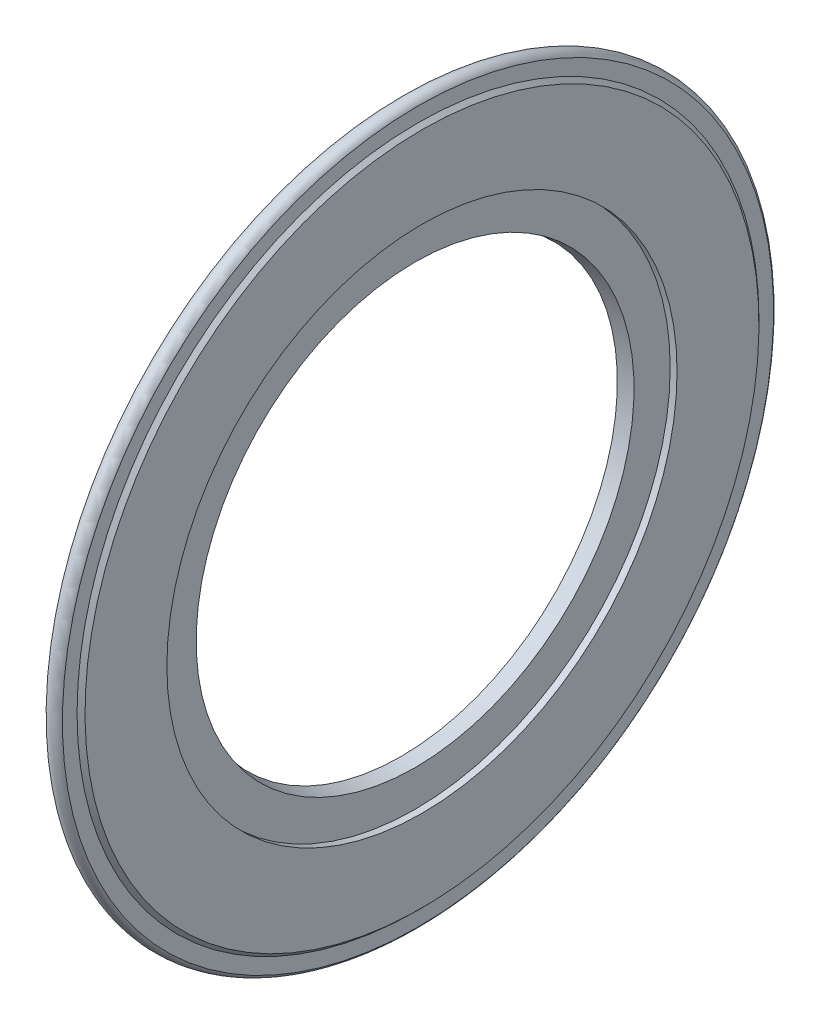
ISO-10303-21;
HEADER;
FILE_DESCRIPTION(('STEP AP214'),'2;1');
FILE_NAME('part.step','',(''),(''),'','','');
FILE_SCHEMA(('AUTOMOTIVE_DESIGN { 1 0 10303 214 1 1 1 1 }'));
ENDSEC;
DATA;
#1=APPLICATION_CONTEXT('core data for automotive mechanical design processes');
#2=APPLICATION_PROTOCOL_DEFINITION('international standard','automotive_design',2000,#1);
#3=PRODUCT_CONTEXT('',#1,'mechanical');
#4=PRODUCT('Part','Part','',(#3));
#5=PRODUCT_RELATED_PRODUCT_CATEGORY('part','',(#4));
#6=PRODUCT_DEFINITION_FORMATION('','',#4);
#7=PRODUCT_DEFINITION_CONTEXT('part definition',#1,'design');
#8=PRODUCT_DEFINITION('design','',#6,#7);
#9=PRODUCT_DEFINITION_SHAPE('','',#8);
#10=(LENGTH_UNIT() NAMED_UNIT(*) SI_UNIT(.MILLI.,.METRE.));
#11=(NAMED_UNIT(*) PLANE_ANGLE_UNIT() SI_UNIT($,.RADIAN.));
#12=(NAMED_UNIT(*) SI_UNIT($,.STERADIAN.) SOLID_ANGLE_UNIT());
#13=UNCERTAINTY_MEASURE_WITH_UNIT(LENGTH_MEASURE(1.E-05),#10,'distance_accuracy_value','');
#14=(GEOMETRIC_REPRESENTATION_CONTEXT(3) GLOBAL_UNCERTAINTY_ASSIGNED_CONTEXT((#13)) GLOBAL_UNIT_ASSIGNED_CONTEXT((#10,
#11,#12)) REPRESENTATION_CONTEXT('',''));
#15=CARTESIAN_POINT('',(0.,0.,0.));
#16=DIRECTION('',(0.,0.,1.));
#17=DIRECTION('',(1.,0.,0.));
#18=AXIS2_PLACEMENT_3D('',#15,#16,#17);
#19=CARTESIAN_POINT('',(11.2134,0.,0.));
#20=DIRECTION('',(1.,0.,0.));
#21=DIRECTION('',(0.,1.,0.));
#22=AXIS2_PLACEMENT_3D('',#19,#20,#21);
#23=CONICAL_SURFACE('',#22,10.8581303859662,0.174532925199433);
#24=CARTESIAN_POINT('',(10.86,0.,0.));
#25=DIRECTION('',(-1.,0.,0.));
#26=DIRECTION('',(0.,1.,0.));
#27=AXIS2_PLACEMENT_3D('',#24,#25,#26);
#28=CIRCLE('',#27,10.7958164309839);
#29=CARTESIAN_POINT('',(10.86,10.7958164309839,0.));
#30=VERTEX_POINT('',#29);
#31=EDGE_CURVE('E11',#30,#30,#28,.T.);
#32=ORIENTED_EDGE('',*,*,#31,.T.);
#33=EDGE_LOOP('',(#32));
#34=FACE_BOUND('',#33,.T.);
#35=CARTESIAN_POINT('',(11.5668,0.,0.));
#36=DIRECTION('',(-1.,0.,0.));
#37=DIRECTION('',(0.,1.,0.));
#38=AXIS2_PLACEMENT_3D('',#35,#36,#37);
#39=CIRCLE('',#38,10.9204443409486);
#40=CARTESIAN_POINT('',(11.5668,10.9204443409486,0.));
#41=VERTEX_POINT('',#40);
#42=EDGE_CURVE('E74',#41,#41,#39,.T.);
#43=ORIENTED_EDGE('',*,*,#42,.F.);
#44=EDGE_LOOP('',(#43));
#45=FACE_BOUND('',#44,.T.);
#46=ADVANCED_FACE('F16',(#34,#45),#23,.F.);
#47=CARTESIAN_POINT('',(10.6900266473844,0.,0.));
#48=DIRECTION('',(-1.,0.,0.));
#49=DIRECTION('',(0.,1.,0.));
#50=AXIS2_PLACEMENT_3D('',#47,#48,#49);
#51=CONICAL_SURFACE('',#50,11.7597832154919,1.39626340159546);
#52=CARTESIAN_POINT('',(10.5200532947689,0.,0.));
#53=DIRECTION('',(-1.,0.,0.));
#54=DIRECTION('',(0.,1.,0.));
#55=AXIS2_PLACEMENT_3D('',#52,#53,#54);
#56=CIRCLE('',#55,12.72375);
#57=CARTESIAN_POINT('',(10.5200532947689,12.72375,0.));
#58=VERTEX_POINT('',#57);
#59=EDGE_CURVE('E26',#58,#58,#56,.T.);
#60=ORIENTED_EDGE('',*,*,#59,.T.);
#61=EDGE_LOOP('',(#60));
#62=FACE_BOUND('',#61,.T.);
#63=ORIENTED_EDGE('',*,*,#31,.F.);
#64=EDGE_LOOP('',(#63));
#65=FACE_BOUND('',#64,.T.);
#66=ADVANCED_FACE('F99',(#62,#65),#51,.F.);
#67=CARTESIAN_POINT('',(10.3480266473844,0.,0.));
#68=DIRECTION('',(1.,0.,0.));
#69=DIRECTION('',(0.,1.,0.));
#70=AXIS2_PLACEMENT_3D('',#67,#68,#69);
#71=CYLINDRICAL_SURFACE('',#70,12.72375);
#72=CARTESIAN_POINT('',(10.176,0.,0.));
#73=DIRECTION('',(-1.,0.,0.));
#74=DIRECTION('',(0.,1.,0.));
#75=AXIS2_PLACEMENT_3D('',#72,#73,#74);
#76=CIRCLE('',#75,12.72375);
#77=CARTESIAN_POINT('',(10.176,12.72375,0.));
#78=VERTEX_POINT('',#77);
#79=EDGE_CURVE('E92',#78,#78,#76,.T.);
#80=ORIENTED_EDGE('',*,*,#79,.T.);
#81=EDGE_LOOP('',(#80));
#82=FACE_BOUND('',#81,.T.);
#83=ORIENTED_EDGE('',*,*,#59,.F.);
#84=EDGE_LOOP('',(#83));
#85=FACE_BOUND('',#84,.T.);
#86=ADVANCED_FACE('F18',(#82,#85),#71,.F.);
#87=CARTESIAN_POINT('',(10.7004,0.,0.));
#88=DIRECTION('',(1.,0.,0.));
#89=DIRECTION('',(0.,1.,0.));
#90=AXIS2_PLACEMENT_3D('',#87,#88,#89);
#91=CONICAL_SURFACE('',#90,13.24815,0.785398163397449);
#92=CARTESIAN_POINT('',(11.2248,0.,0.));
#93=DIRECTION('',(-1.,0.,0.));
#94=DIRECTION('',(0.,1.,0.));
#95=AXIS2_PLACEMENT_3D('',#92,#93,#94);
#96=CIRCLE('',#95,13.77255);
#97=CARTESIAN_POINT('',(11.2248,13.77255,0.));
#98=VERTEX_POINT('',#97);
#99=EDGE_CURVE('E59',#98,#98,#96,.T.);
#100=ORIENTED_EDGE('',*,*,#99,.T.);
#101=EDGE_LOOP('',(#100));
#102=FACE_BOUND('',#101,.T.);
#103=ORIENTED_EDGE('',*,*,#79,.F.);
#104=EDGE_LOOP('',(#103));
#105=FACE_BOUND('',#104,.T.);
#106=ADVANCED_FACE('F103',(#102,#105),#91,.T.);
#107=CARTESIAN_POINT('',(11.2248,15.0975375,0.));
#108=DIRECTION('',(-1.,0.,0.));
#109=DIRECTION('',(0.,1.,0.));
#110=AXIS2_PLACEMENT_3D('',#107,#108,#109);
#111=PLANE('',#110);
#112=CARTESIAN_POINT('',(11.2248,0.,0.));
#113=DIRECTION('',(-1.,0.,0.));
#114=DIRECTION('',(0.,1.,0.));
#115=AXIS2_PLACEMENT_3D('',#112,#113,#114);
#116=CIRCLE('',#115,16.422525);
#117=CARTESIAN_POINT('',(11.2248,16.422525,0.));
#118=VERTEX_POINT('',#117);
#119=EDGE_CURVE('E64',#118,#118,#116,.T.);
#120=ORIENTED_EDGE('',*,*,#119,.T.);
#121=EDGE_LOOP('',(#120));
#122=FACE_BOUND('',#121,.T.);
#123=ORIENTED_EDGE('',*,*,#99,.F.);
#124=EDGE_LOOP('',(#123));
#125=FACE_BOUND('',#124,.T.);
#126=ADVANCED_FACE('F109',(#122,#125),#111,.T.);
#127=CARTESIAN_POINT('',(10.9432284311779,0.,0.));
#128=DIRECTION('',(1.,0.,0.));
#129=DIRECTION('',(0.,1.,0.));
#130=AXIS2_PLACEMENT_3D('',#127,#128,#129);
#131=CYLINDRICAL_SURFACE('',#130,16.422525);
#132=CARTESIAN_POINT('',(10.6616568623557,0.,0.));
#133=DIRECTION('',(-1.,0.,0.));
#134=DIRECTION('',(0.,1.,0.));
#135=AXIS2_PLACEMENT_3D('',#132,#133,#134);
#136=CIRCLE('',#135,16.422525);
#137=CARTESIAN_POINT('',(10.6616568623557,16.422525,0.));
#138=VERTEX_POINT('',#137);
#139=EDGE_CURVE('E20',#138,#138,#136,.T.);
#140=ORIENTED_EDGE('',*,*,#139,.T.);
#141=EDGE_LOOP('',(#140));
#142=FACE_BOUND('',#141,.T.);
#143=ORIENTED_EDGE('',*,*,#119,.F.);
#144=EDGE_LOOP('',(#143));
#145=FACE_BOUND('',#144,.T.);
#146=ADVANCED_FACE('F132',(#142,#145),#131,.F.);
#147=CARTESIAN_POINT('',(10.7642922634911,0.,0.));
#148=DIRECTION('',(1.,0.,0.));
#149=DIRECTION('',(0.,1.,0.));
#150=AXIS2_PLACEMENT_3D('',#147,#148,#149);
#151=CONICAL_SURFACE('',#150,17.004599284508,1.39626340159546);
#152=CARTESIAN_POINT('',(10.8669276646264,0.,0.));
#153=DIRECTION('',(-1.,0.,0.));
#154=DIRECTION('',(0.,1.,0.));
#155=AXIS2_PLACEMENT_3D('',#152,#153,#154);
#156=CIRCLE('',#155,17.5866735690161);
#157=CARTESIAN_POINT('',(10.8669276646264,17.5866735690161,0.));
#158=VERTEX_POINT('',#157);
#159=EDGE_CURVE('E90',#158,#158,#156,.T.);
#160=ORIENTED_EDGE('',*,*,#159,.T.);
#161=EDGE_LOOP('',(#160));
#162=FACE_BOUND('',#161,.T.);
#163=ORIENTED_EDGE('',*,*,#139,.F.);
#164=EDGE_LOOP('',(#163));
#165=FACE_BOUND('',#164,.T.);
#166=ADVANCED_FACE('F129',(#162,#165),#151,.T.);
#167=CARTESIAN_POINT('',(11.316,0.,0.));
#168=DIRECTION('',(-1.,0.,0.));
#169=DIRECTION('',(0.,0.,1.));
#170=AXIS2_PLACEMENT_3D('',#167,#168,#169);
#171=TOROIDAL_SURFACE('',#170,17.50749,0.456);
#172=CARTESIAN_POINT('',(11.7109075841257,0.,0.));
#173=DIRECTION('',(-1.,0.,0.));
#174=DIRECTION('',(0.,1.,0.));
#175=AXIS2_PLACEMENT_3D('',#172,#173,#174);
#176=CIRCLE('',#175,17.73549);
#177=CARTESIAN_POINT('',(11.7109075841257,17.73549,0.));
#178=VERTEX_POINT('',#177);
#179=EDGE_CURVE('E88',#178,#178,#176,.T.);
#180=ORIENTED_EDGE('',*,*,#179,.T.);
#181=EDGE_LOOP('',(#180));
#182=FACE_BOUND('',#181,.T.);
#183=ORIENTED_EDGE('',*,*,#159,.F.);
#184=EDGE_LOOP('',(#183));
#185=FACE_BOUND('',#184,.T.);
#186=ADVANCED_FACE('F125',(#182,#185),#171,.T.);
#187=CARTESIAN_POINT('',(11.7109075841257,17.37069,0.));
#188=DIRECTION('',(1.,0.,0.));
#189=DIRECTION('',(0.,-1.,0.));
#190=AXIS2_PLACEMENT_3D('',#187,#188,#189);
#191=PLANE('',#190);
#192=CARTESIAN_POINT('',(11.7109075841257,0.,0.));
#193=DIRECTION('',(-1.,0.,0.));
#194=DIRECTION('',(0.,1.,0.));
#195=AXIS2_PLACEMENT_3D('',#192,#193,#194);
#196=CIRCLE('',#195,17.00589);
#197=CARTESIAN_POINT('',(11.7109075841257,17.00589,0.));
#198=VERTEX_POINT('',#197);
#199=EDGE_CURVE('E87',#198,#198,#196,.T.);
#200=ORIENTED_EDGE('',*,*,#199,.T.);
#201=EDGE_LOOP('',(#200));
#202=FACE_BOUND('',#201,.T.);
#203=ORIENTED_EDGE('',*,*,#179,.F.);
#204=EDGE_LOOP('',(#203));
#205=FACE_BOUND('',#204,.T.);
#206=ADVANCED_FACE('F128',(#202,#205),#191,.T.);
#207=CARTESIAN_POINT('',(11.8098537920628,0.,0.));
#208=DIRECTION('',(-1.,0.,0.));
#209=DIRECTION('',(0.,1.,0.));
#210=AXIS2_PLACEMENT_3D('',#207,#208,#209);
#211=CONICAL_SURFACE('',#210,16.9069437920629,0.785398163397443);
#212=CARTESIAN_POINT('',(11.9088,0.,0.));
#213=DIRECTION('',(-1.,0.,0.));
#214=DIRECTION('',(0.,1.,0.));
#215=AXIS2_PLACEMENT_3D('',#212,#213,#214);
#216=CIRCLE('',#215,16.8079975841257);
#217=CARTESIAN_POINT('',(11.9088,16.8079975841257,0.));
#218=VERTEX_POINT('',#217);
#219=EDGE_CURVE('E80',#218,#218,#216,.T.);
#220=ORIENTED_EDGE('',*,*,#219,.T.);
#221=EDGE_LOOP('',(#220));
#222=FACE_BOUND('',#221,.T.);
#223=ORIENTED_EDGE('',*,*,#199,.F.);
#224=EDGE_LOOP('',(#223));
#225=FACE_BOUND('',#224,.T.);
#226=ADVANCED_FACE('F124',(#222,#225),#211,.T.);
#227=CARTESIAN_POINT('',(11.9088,14.7658737920628,0.));
#228=DIRECTION('',(1.,0.,0.));
#229=DIRECTION('',(0.,-1.,0.));
#230=AXIS2_PLACEMENT_3D('',#227,#228,#229);
#231=PLANE('',#230);
#232=CARTESIAN_POINT('',(11.9088,0.,0.));
#233=DIRECTION('',(-1.,0.,0.));
#234=DIRECTION('',(0.,1.,0.));
#235=AXIS2_PLACEMENT_3D('',#232,#233,#234);
#236=CIRCLE('',#235,12.72375);
#237=CARTESIAN_POINT('',(11.9088,12.72375,0.));
#238=VERTEX_POINT('',#237);
#239=EDGE_CURVE('E70',#238,#238,#236,.T.);
#240=ORIENTED_EDGE('',*,*,#239,.T.);
#241=EDGE_LOOP('',(#240));
#242=FACE_BOUND('',#241,.T.);
#243=ORIENTED_EDGE('',*,*,#219,.F.);
#244=EDGE_LOOP('',(#243));
#245=FACE_BOUND('',#244,.T.);
#246=ADVANCED_FACE('F121',(#242,#245),#231,.T.);
#247=CARTESIAN_POINT('',(11.7378,0.,0.));
#248=DIRECTION('',(1.,0.,0.));
#249=DIRECTION('',(0.,1.,0.));
#250=AXIS2_PLACEMENT_3D('',#247,#248,#249);
#251=CYLINDRICAL_SURFACE('',#250,12.72375);
#252=CARTESIAN_POINT('',(11.5668,0.,0.));
#253=DIRECTION('',(-1.,0.,0.));
#254=DIRECTION('',(0.,1.,0.));
#255=AXIS2_PLACEMENT_3D('',#252,#253,#254);
#256=CIRCLE('',#255,12.72375);
#257=CARTESIAN_POINT('',(11.5668,12.72375,0.));
#258=VERTEX_POINT('',#257);
#259=EDGE_CURVE('E78',#258,#258,#256,.T.);
#260=ORIENTED_EDGE('',*,*,#259,.T.);
#261=EDGE_LOOP('',(#260));
#262=FACE_BOUND('',#261,.T.);
#263=ORIENTED_EDGE('',*,*,#239,.F.);
#264=EDGE_LOOP('',(#263));
#265=FACE_BOUND('',#264,.T.);
#266=ADVANCED_FACE('F120',(#262,#265),#251,.F.);
#267=CARTESIAN_POINT('',(11.5668,11.8220971704743,0.));
#268=DIRECTION('',(1.,0.,0.));
#269=DIRECTION('',(0.,-1.,0.));
#270=AXIS2_PLACEMENT_3D('',#267,#268,#269);
#271=PLANE('',#270);
#272=ORIENTED_EDGE('',*,*,#42,.T.);
#273=EDGE_LOOP('',(#272));
#274=FACE_BOUND('',#273,.T.);
#275=ORIENTED_EDGE('',*,*,#259,.F.);
#276=EDGE_LOOP('',(#275));
#277=FACE_BOUND('',#276,.T.);
#278=ADVANCED_FACE('F75',(#274,#277),#271,.T.);
#279=CLOSED_SHELL('',(#46,#66,#86,#106,#126,#146,#166,#186,#206,#226,#246,#266,#278));
#280=MANIFOLD_SOLID_BREP('B1',#279);
#281=ADVANCED_BREP_SHAPE_REPRESENTATION('',(#18,#280),#14);
#282=SHAPE_DEFINITION_REPRESENTATION(#9,#281);
ENDSEC;
END-ISO-10303-21;
